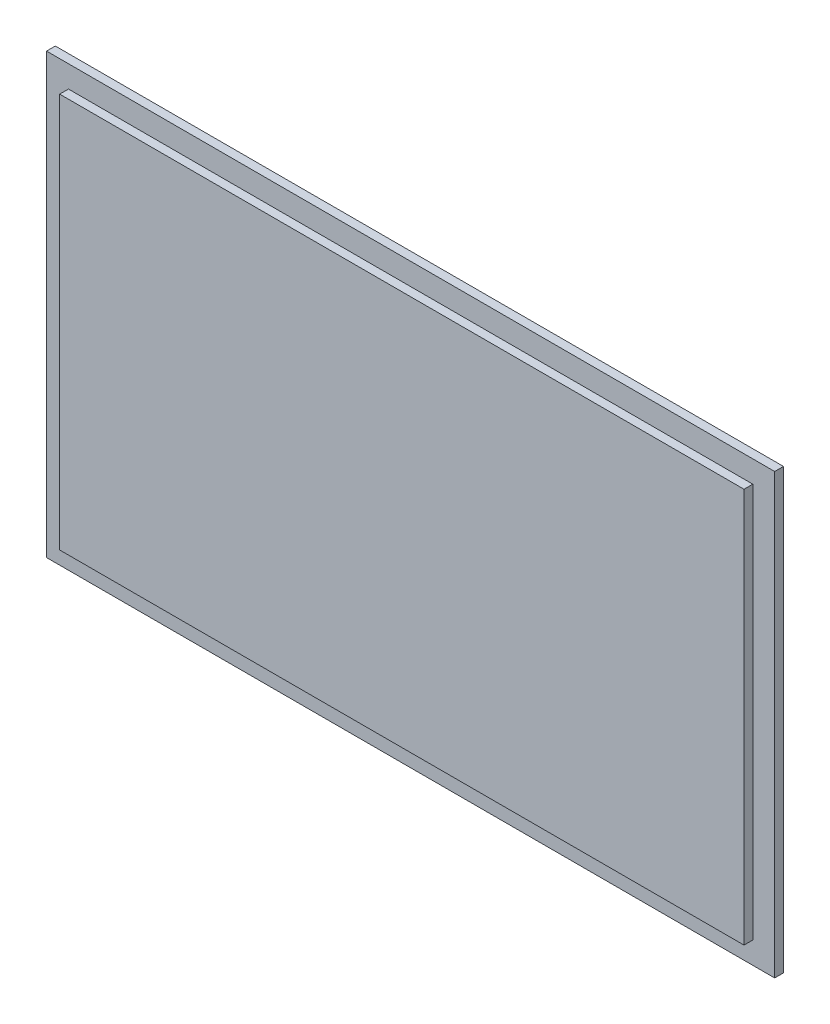
ISO-10303-21;
HEADER;
FILE_DESCRIPTION(('STEP AP214'),'2;1');
FILE_NAME('part.step','',(''),(''),'','','');
FILE_SCHEMA(('AUTOMOTIVE_DESIGN { 1 0 10303 214 1 1 1 1 }'));
ENDSEC;
DATA;
#1=APPLICATION_CONTEXT('core data for automotive mechanical design processes');
#2=APPLICATION_PROTOCOL_DEFINITION('international standard','automotive_design',2000,#1);
#3=PRODUCT_CONTEXT('',#1,'mechanical');
#4=PRODUCT('Part','Part','',(#3));
#5=PRODUCT_RELATED_PRODUCT_CATEGORY('part','',(#4));
#6=PRODUCT_DEFINITION_FORMATION('','',#4);
#7=PRODUCT_DEFINITION_CONTEXT('part definition',#1,'design');
#8=PRODUCT_DEFINITION('design','',#6,#7);
#9=PRODUCT_DEFINITION_SHAPE('','',#8);
#10=(LENGTH_UNIT() NAMED_UNIT(*) SI_UNIT(.MILLI.,.METRE.));
#11=(NAMED_UNIT(*) PLANE_ANGLE_UNIT() SI_UNIT($,.RADIAN.));
#12=(NAMED_UNIT(*) SI_UNIT($,.STERADIAN.) SOLID_ANGLE_UNIT());
#13=UNCERTAINTY_MEASURE_WITH_UNIT(LENGTH_MEASURE(1.E-05),#10,'distance_accuracy_value','');
#14=(GEOMETRIC_REPRESENTATION_CONTEXT(3) GLOBAL_UNCERTAINTY_ASSIGNED_CONTEXT((#13)) GLOBAL_UNIT_ASSIGNED_CONTEXT((#10,
#11,#12)) REPRESENTATION_CONTEXT('',''));
#15=CARTESIAN_POINT('',(0.,0.,0.));
#16=DIRECTION('',(0.,0.,1.));
#17=DIRECTION('',(1.,0.,0.));
#18=AXIS2_PLACEMENT_3D('',#15,#16,#17);
#19=CARTESIAN_POINT('',(0.,0.,-2.));
#20=DIRECTION('',(0.,0.,-1.));
#21=DIRECTION('',(-1.,0.,0.));
#22=AXIS2_PLACEMENT_3D('',#19,#20,#21);
#23=PLANE('',#22);
#24=DIRECTION('',(0.,1.,0.));
#25=VECTOR('',#24,1.);
#26=CARTESIAN_POINT('',(-83.,-50.,-2.));
#27=LINE('',#26,#25);
#28=CARTESIAN_POINT('',(-83.,-50.,-2.));
#29=VERTEX_POINT('',#28);
#30=CARTESIAN_POINT('',(-83.,50.,-2.));
#31=VERTEX_POINT('',#30);
#32=EDGE_CURVE('E154',#29,#31,#27,.T.);
#33=ORIENTED_EDGE('',*,*,#32,.T.);
#34=DIRECTION('',(1.,0.,0.));
#35=VECTOR('',#34,1.);
#36=CARTESIAN_POINT('',(-83.,50.,-2.));
#37=LINE('',#36,#35);
#38=CARTESIAN_POINT('',(83.,50.,-2.));
#39=VERTEX_POINT('',#38);
#40=EDGE_CURVE('E157',#31,#39,#37,.T.);
#41=ORIENTED_EDGE('',*,*,#40,.T.);
#42=DIRECTION('',(0.,-1.,0.));
#43=VECTOR('',#42,1.);
#44=CARTESIAN_POINT('',(83.,50.,-2.));
#45=LINE('',#44,#43);
#46=CARTESIAN_POINT('',(83.,-50.,-2.));
#47=VERTEX_POINT('',#46);
#48=EDGE_CURVE('E160',#39,#47,#45,.T.);
#49=ORIENTED_EDGE('',*,*,#48,.T.);
#50=DIRECTION('',(-1.,0.,0.));
#51=VECTOR('',#50,1.);
#52=CARTESIAN_POINT('',(83.,-50.,-2.));
#53=LINE('',#52,#51);
#54=EDGE_CURVE('E162',#47,#29,#53,.T.);
#55=ORIENTED_EDGE('',*,*,#54,.T.);
#56=EDGE_LOOP('',(#33,#41,#49,#55));
#57=FACE_BOUND('',#56,.T.);
#58=DIRECTION('',(0.,1.,0.));
#59=VECTOR('',#58,1.);
#60=CARTESIAN_POINT('',(-78.,-45.,-2.));
#61=LINE('',#60,#59);
#62=CARTESIAN_POINT('',(-78.,-45.,-2.));
#63=VERTEX_POINT('',#62);
#64=CARTESIAN_POINT('',(-78.,45.,-2.));
#65=VERTEX_POINT('',#64);
#66=EDGE_CURVE('E126',#63,#65,#61,.T.);
#67=ORIENTED_EDGE('',*,*,#66,.F.);
#68=DIRECTION('',(-1.,0.,0.));
#69=VECTOR('',#68,1.);
#70=CARTESIAN_POINT('',(78.,-45.,-2.));
#71=LINE('',#70,#69);
#72=CARTESIAN_POINT('',(78.,-45.,-2.));
#73=VERTEX_POINT('',#72);
#74=EDGE_CURVE('E118',#73,#63,#71,.T.);
#75=ORIENTED_EDGE('',*,*,#74,.F.);
#76=DIRECTION('',(0.,-1.,0.));
#77=VECTOR('',#76,1.);
#78=CARTESIAN_POINT('',(78.,45.,-2.));
#79=LINE('',#78,#77);
#80=CARTESIAN_POINT('',(78.,45.,-2.));
#81=VERTEX_POINT('',#80);
#82=EDGE_CURVE('E140',#81,#73,#79,.T.);
#83=ORIENTED_EDGE('',*,*,#82,.F.);
#84=DIRECTION('',(1.,0.,0.));
#85=VECTOR('',#84,1.);
#86=CARTESIAN_POINT('',(-78.,45.,-2.));
#87=LINE('',#86,#85);
#88=EDGE_CURVE('E138',#65,#81,#87,.T.);
#89=ORIENTED_EDGE('',*,*,#88,.F.);
#90=EDGE_LOOP('',(#67,#75,#83,#89));
#91=FACE_BOUND('',#90,.T.);
#92=ADVANCED_FACE('F53',(#57,#91),#23,.T.);
#93=CARTESIAN_POINT('',(0.,0.,0.));
#94=DIRECTION('',(0.,0.,-1.));
#95=DIRECTION('',(-1.,0.,0.));
#96=AXIS2_PLACEMENT_3D('',#93,#94,#95);
#97=PLANE('',#96);
#98=DIRECTION('',(0.,1.,0.));
#99=VECTOR('',#98,1.);
#100=CARTESIAN_POINT('',(-83.,-50.,0.));
#101=LINE('',#100,#99);
#102=CARTESIAN_POINT('',(-83.,-50.,0.));
#103=VERTEX_POINT('',#102);
#104=CARTESIAN_POINT('',(-83.,50.,0.));
#105=VERTEX_POINT('',#104);
#106=EDGE_CURVE('E134',#103,#105,#101,.T.);
#107=ORIENTED_EDGE('',*,*,#106,.F.);
#108=DIRECTION('',(-1.,0.,0.));
#109=VECTOR('',#108,1.);
#110=CARTESIAN_POINT('',(83.,-50.,0.));
#111=LINE('',#110,#109);
#112=CARTESIAN_POINT('',(83.,-50.,0.));
#113=VERTEX_POINT('',#112);
#114=EDGE_CURVE('E158',#113,#103,#111,.T.);
#115=ORIENTED_EDGE('',*,*,#114,.F.);
#116=DIRECTION('',(0.,-1.,0.));
#117=VECTOR('',#116,1.);
#118=CARTESIAN_POINT('',(83.,50.,0.));
#119=LINE('',#118,#117);
#120=CARTESIAN_POINT('',(83.,50.,0.));
#121=VERTEX_POINT('',#120);
#122=EDGE_CURVE('E169',#121,#113,#119,.T.);
#123=ORIENTED_EDGE('',*,*,#122,.F.);
#124=DIRECTION('',(1.,0.,0.));
#125=VECTOR('',#124,1.);
#126=CARTESIAN_POINT('',(-83.,50.,0.));
#127=LINE('',#126,#125);
#128=EDGE_CURVE('E167',#105,#121,#127,.T.);
#129=ORIENTED_EDGE('',*,*,#128,.F.);
#130=EDGE_LOOP('',(#107,#115,#123,#129));
#131=FACE_BOUND('',#130,.T.);
#132=DIRECTION('',(-1.,0.,0.));
#133=VECTOR('',#132,1.);
#134=CARTESIAN_POINT('',(78.,-45.,0.));
#135=LINE('',#134,#133);
#136=CARTESIAN_POINT('',(78.,-45.,0.));
#137=VERTEX_POINT('',#136);
#138=CARTESIAN_POINT('',(-78.,-45.,0.));
#139=VERTEX_POINT('',#138);
#140=EDGE_CURVE('E76',#137,#139,#135,.T.);
#141=ORIENTED_EDGE('',*,*,#140,.T.);
#142=DIRECTION('',(0.,1.,0.));
#143=VECTOR('',#142,1.);
#144=CARTESIAN_POINT('',(-78.,-45.,0.));
#145=LINE('',#144,#143);
#146=CARTESIAN_POINT('',(-78.,45.,0.));
#147=VERTEX_POINT('',#146);
#148=EDGE_CURVE('E133',#139,#147,#145,.T.);
#149=ORIENTED_EDGE('',*,*,#148,.T.);
#150=DIRECTION('',(1.,0.,0.));
#151=VECTOR('',#150,1.);
#152=CARTESIAN_POINT('',(-78.,45.,0.));
#153=LINE('',#152,#151);
#154=CARTESIAN_POINT('',(78.,45.,0.));
#155=VERTEX_POINT('',#154);
#156=EDGE_CURVE('E146',#147,#155,#153,.T.);
#157=ORIENTED_EDGE('',*,*,#156,.T.);
#158=DIRECTION('',(0.,-1.,0.));
#159=VECTOR('',#158,1.);
#160=CARTESIAN_POINT('',(78.,45.,0.));
#161=LINE('',#160,#159);
#162=EDGE_CURVE('E127',#155,#137,#161,.T.);
#163=ORIENTED_EDGE('',*,*,#162,.T.);
#164=EDGE_LOOP('',(#141,#149,#157,#163));
#165=FACE_BOUND('',#164,.T.);
#166=ADVANCED_FACE('F187',(#131,#165),#97,.F.);
#167=CARTESIAN_POINT('',(-83.,-50.,-2.));
#168=DIRECTION('',(1.,0.,0.));
#169=DIRECTION('',(0.,0.,-1.));
#170=AXIS2_PLACEMENT_3D('',#167,#168,#169);
#171=PLANE('',#170);
#172=ORIENTED_EDGE('',*,*,#106,.T.);
#173=DIRECTION('',(0.,0.,1.));
#174=VECTOR('',#173,1.);
#175=CARTESIAN_POINT('',(-83.,50.,-2.));
#176=LINE('',#175,#174);
#177=EDGE_CURVE('E12',#31,#105,#176,.T.);
#178=ORIENTED_EDGE('',*,*,#177,.F.);
#179=ORIENTED_EDGE('',*,*,#32,.F.);
#180=DIRECTION('',(0.,0.,1.));
#181=VECTOR('',#180,1.);
#182=CARTESIAN_POINT('',(-83.,-50.,-2.));
#183=LINE('',#182,#181);
#184=EDGE_CURVE('E164',#29,#103,#183,.T.);
#185=ORIENTED_EDGE('',*,*,#184,.T.);
#186=EDGE_LOOP('',(#172,#178,#179,#185));
#187=FACE_BOUND('',#186,.T.);
#188=ADVANCED_FACE('F55',(#187),#171,.F.);
#189=CARTESIAN_POINT('',(-83.,50.,-2.));
#190=DIRECTION('',(0.,-1.,0.));
#191=DIRECTION('',(0.,0.,-1.));
#192=AXIS2_PLACEMENT_3D('',#189,#190,#191);
#193=PLANE('',#192);
#194=ORIENTED_EDGE('',*,*,#128,.T.);
#195=DIRECTION('',(0.,0.,1.));
#196=VECTOR('',#195,1.);
#197=CARTESIAN_POINT('',(83.,50.,-2.));
#198=LINE('',#197,#196);
#199=EDGE_CURVE('E61',#39,#121,#198,.T.);
#200=ORIENTED_EDGE('',*,*,#199,.F.);
#201=ORIENTED_EDGE('',*,*,#40,.F.);
#202=ORIENTED_EDGE('',*,*,#177,.T.);
#203=EDGE_LOOP('',(#194,#200,#201,#202));
#204=FACE_BOUND('',#203,.T.);
#205=ADVANCED_FACE('F197',(#204),#193,.F.);
#206=CARTESIAN_POINT('',(83.,50.,-2.));
#207=DIRECTION('',(-1.,0.,0.));
#208=DIRECTION('',(0.,0.,1.));
#209=AXIS2_PLACEMENT_3D('',#206,#207,#208);
#210=PLANE('',#209);
#211=ORIENTED_EDGE('',*,*,#122,.T.);
#212=DIRECTION('',(0.,0.,1.));
#213=VECTOR('',#212,1.);
#214=CARTESIAN_POINT('',(83.,-50.,-2.));
#215=LINE('',#214,#213);
#216=EDGE_CURVE('E174',#47,#113,#215,.T.);
#217=ORIENTED_EDGE('',*,*,#216,.F.);
#218=ORIENTED_EDGE('',*,*,#48,.F.);
#219=ORIENTED_EDGE('',*,*,#199,.T.);
#220=EDGE_LOOP('',(#211,#217,#218,#219));
#221=FACE_BOUND('',#220,.T.);
#222=ADVANCED_FACE('F181',(#221),#210,.F.);
#223=CARTESIAN_POINT('',(83.,-50.,-2.));
#224=DIRECTION('',(0.,1.,0.));
#225=DIRECTION('',(0.,0.,1.));
#226=AXIS2_PLACEMENT_3D('',#223,#224,#225);
#227=PLANE('',#226);
#228=ORIENTED_EDGE('',*,*,#114,.T.);
#229=ORIENTED_EDGE('',*,*,#184,.F.);
#230=ORIENTED_EDGE('',*,*,#54,.F.);
#231=ORIENTED_EDGE('',*,*,#216,.T.);
#232=EDGE_LOOP('',(#228,#229,#230,#231));
#233=FACE_BOUND('',#232,.T.);
#234=ADVANCED_FACE('F191',(#233),#227,.F.);
#235=CARTESIAN_POINT('',(78.,-45.,-2.));
#236=DIRECTION('',(0.,1.,0.));
#237=DIRECTION('',(-1.,0.,0.));
#238=AXIS2_PLACEMENT_3D('',#235,#236,#237);
#239=PLANE('',#238);
#240=ORIENTED_EDGE('',*,*,#140,.F.);
#241=DIRECTION('',(0.,0.,1.));
#242=VECTOR('',#241,1.);
#243=CARTESIAN_POINT('',(78.,-45.,-2.));
#244=LINE('',#243,#242);
#245=EDGE_CURVE('E122',#73,#137,#244,.T.);
#246=ORIENTED_EDGE('',*,*,#245,.F.);
#247=ORIENTED_EDGE('',*,*,#74,.T.);
#248=DIRECTION('',(0.,0.,1.));
#249=VECTOR('',#248,1.);
#250=CARTESIAN_POINT('',(-78.,-45.,-2.));
#251=LINE('',#250,#249);
#252=EDGE_CURVE('E121',#63,#139,#251,.T.);
#253=ORIENTED_EDGE('',*,*,#252,.T.);
#254=EDGE_LOOP('',(#240,#246,#247,#253));
#255=FACE_BOUND('',#254,.T.);
#256=ADVANCED_FACE('F120',(#255),#239,.T.);
#257=CARTESIAN_POINT('',(-78.,-45.,-2.));
#258=DIRECTION('',(1.,0.,0.));
#259=DIRECTION('',(0.,0.,-1.));
#260=AXIS2_PLACEMENT_3D('',#257,#258,#259);
#261=PLANE('',#260);
#262=ORIENTED_EDGE('',*,*,#148,.F.);
#263=ORIENTED_EDGE('',*,*,#252,.F.);
#264=ORIENTED_EDGE('',*,*,#66,.T.);
#265=DIRECTION('',(0.,0.,1.));
#266=VECTOR('',#265,1.);
#267=CARTESIAN_POINT('',(-78.,45.,-2.));
#268=LINE('',#267,#266);
#269=EDGE_CURVE('E135',#65,#147,#268,.T.);
#270=ORIENTED_EDGE('',*,*,#269,.T.);
#271=EDGE_LOOP('',(#262,#263,#264,#270));
#272=FACE_BOUND('',#271,.T.);
#273=ADVANCED_FACE('F130',(#272),#261,.T.);
#274=CARTESIAN_POINT('',(-78.,45.,-2.));
#275=DIRECTION('',(0.,-1.,0.));
#276=DIRECTION('',(1.,0.,0.));
#277=AXIS2_PLACEMENT_3D('',#274,#275,#276);
#278=PLANE('',#277);
#279=ORIENTED_EDGE('',*,*,#156,.F.);
#280=ORIENTED_EDGE('',*,*,#269,.F.);
#281=ORIENTED_EDGE('',*,*,#88,.T.);
#282=DIRECTION('',(0.,0.,1.));
#283=VECTOR('',#282,1.);
#284=CARTESIAN_POINT('',(78.,45.,-2.));
#285=LINE('',#284,#283);
#286=EDGE_CURVE('E68',#81,#155,#285,.T.);
#287=ORIENTED_EDGE('',*,*,#286,.T.);
#288=EDGE_LOOP('',(#279,#280,#281,#287));
#289=FACE_BOUND('',#288,.T.);
#290=ADVANCED_FACE('F220',(#289),#278,.T.);
#291=CARTESIAN_POINT('',(78.,45.,-2.));
#292=DIRECTION('',(-1.,0.,0.));
#293=DIRECTION('',(0.,0.,1.));
#294=AXIS2_PLACEMENT_3D('',#291,#292,#293);
#295=PLANE('',#294);
#296=ORIENTED_EDGE('',*,*,#162,.F.);
#297=ORIENTED_EDGE('',*,*,#286,.F.);
#298=ORIENTED_EDGE('',*,*,#82,.T.);
#299=ORIENTED_EDGE('',*,*,#245,.T.);
#300=EDGE_LOOP('',(#296,#297,#298,#299));
#301=FACE_BOUND('',#300,.T.);
#302=ADVANCED_FACE('F224',(#301),#295,.T.);
#303=CLOSED_SHELL('',(#92,#166,#188,#205,#222,#234,#256,#273,#290,#302));
#304=MANIFOLD_SOLID_BREP('B2',#303);
#305=CARTESIAN_POINT('',(-78.,-45.,2.));
#306=DIRECTION('',(1.,0.,0.));
#307=DIRECTION('',(0.,0.,-1.));
#308=AXIS2_PLACEMENT_3D('',#305,#306,#307);
#309=PLANE('',#308);
#310=DIRECTION('',(0.,-1.,0.));
#311=VECTOR('',#310,1.);
#312=CARTESIAN_POINT('',(-78.,-45.,0.));
#313=LINE('',#312,#311);
#314=CARTESIAN_POINT('',(-78.,45.,0.));
#315=VERTEX_POINT('',#314);
#316=CARTESIAN_POINT('',(-78.,-45.,0.));
#317=VERTEX_POINT('',#316);
#318=EDGE_CURVE('E371',#315,#317,#313,.T.);
#319=ORIENTED_EDGE('',*,*,#318,.T.);
#320=DIRECTION('',(0.,0.,-1.));
#321=VECTOR('',#320,1.);
#322=CARTESIAN_POINT('',(-78.,-45.,2.));
#323=LINE('',#322,#321);
#324=CARTESIAN_POINT('',(-78.,-45.,2.));
#325=VERTEX_POINT('',#324);
#326=EDGE_CURVE('E51',#325,#317,#323,.T.);
#327=ORIENTED_EDGE('',*,*,#326,.F.);
#328=DIRECTION('',(0.,-1.,0.));
#329=VECTOR('',#328,1.);
#330=CARTESIAN_POINT('',(-78.,-45.,2.));
#331=LINE('',#330,#329);
#332=CARTESIAN_POINT('',(-78.,45.,2.));
#333=VERTEX_POINT('',#332);
#334=EDGE_CURVE('E355',#333,#325,#331,.T.);
#335=ORIENTED_EDGE('',*,*,#334,.F.);
#336=DIRECTION('',(0.,0.,-1.));
#337=VECTOR('',#336,1.);
#338=CARTESIAN_POINT('',(-78.,45.,2.));
#339=LINE('',#338,#337);
#340=EDGE_CURVE('E367',#333,#315,#339,.T.);
#341=ORIENTED_EDGE('',*,*,#340,.T.);
#342=EDGE_LOOP('',(#319,#327,#335,#341));
#343=FACE_BOUND('',#342,.T.);
#344=ADVANCED_FACE('F303',(#343),#309,.F.);
#345=CARTESIAN_POINT('',(78.,-45.,2.));
#346=DIRECTION('',(0.,1.,0.));
#347=DIRECTION('',(-1.,0.,0.));
#348=AXIS2_PLACEMENT_3D('',#345,#346,#347);
#349=PLANE('',#348);
#350=DIRECTION('',(1.,0.,0.));
#351=VECTOR('',#350,1.);
#352=CARTESIAN_POINT('',(78.,-45.,0.));
#353=LINE('',#352,#351);
#354=CARTESIAN_POINT('',(78.,-45.,0.));
#355=VERTEX_POINT('',#354);
#356=EDGE_CURVE('E360',#317,#355,#353,.T.);
#357=ORIENTED_EDGE('',*,*,#356,.T.);
#358=DIRECTION('',(0.,0.,-1.));
#359=VECTOR('',#358,1.);
#360=CARTESIAN_POINT('',(78.,-45.,2.));
#361=LINE('',#360,#359);
#362=CARTESIAN_POINT('',(78.,-45.,2.));
#363=VERTEX_POINT('',#362);
#364=EDGE_CURVE('E312',#363,#355,#361,.T.);
#365=ORIENTED_EDGE('',*,*,#364,.F.);
#366=DIRECTION('',(1.,0.,0.));
#367=VECTOR('',#366,1.);
#368=CARTESIAN_POINT('',(78.,-45.,2.));
#369=LINE('',#368,#367);
#370=EDGE_CURVE('E350',#325,#363,#369,.T.);
#371=ORIENTED_EDGE('',*,*,#370,.F.);
#372=ORIENTED_EDGE('',*,*,#326,.T.);
#373=EDGE_LOOP('',(#357,#365,#371,#372));
#374=FACE_BOUND('',#373,.T.);
#375=ADVANCED_FACE('F359',(#374),#349,.F.);
#376=CARTESIAN_POINT('',(78.,-45.,2.));
#377=DIRECTION('',(-1.,0.,0.));
#378=DIRECTION('',(0.,0.,1.));
#379=AXIS2_PLACEMENT_3D('',#376,#377,#378);
#380=PLANE('',#379);
#381=DIRECTION('',(0.,1.,0.));
#382=VECTOR('',#381,1.);
#383=CARTESIAN_POINT('',(78.,-45.,0.));
#384=LINE('',#383,#382);
#385=CARTESIAN_POINT('',(78.,45.,0.));
#386=VERTEX_POINT('',#385);
#387=EDGE_CURVE('E337',#355,#386,#384,.T.);
#388=ORIENTED_EDGE('',*,*,#387,.T.);
#389=DIRECTION('',(0.,0.,-1.));
#390=VECTOR('',#389,1.);
#391=CARTESIAN_POINT('',(78.,45.,2.));
#392=LINE('',#391,#390);
#393=CARTESIAN_POINT('',(78.,45.,2.));
#394=VERTEX_POINT('',#393);
#395=EDGE_CURVE('E362',#394,#386,#392,.T.);
#396=ORIENTED_EDGE('',*,*,#395,.F.);
#397=DIRECTION('',(0.,1.,0.));
#398=VECTOR('',#397,1.);
#399=CARTESIAN_POINT('',(78.,-45.,2.));
#400=LINE('',#399,#398);
#401=EDGE_CURVE('E353',#363,#394,#400,.T.);
#402=ORIENTED_EDGE('',*,*,#401,.F.);
#403=ORIENTED_EDGE('',*,*,#364,.T.);
#404=EDGE_LOOP('',(#388,#396,#402,#403));
#405=FACE_BOUND('',#404,.T.);
#406=ADVANCED_FACE('F363',(#405),#380,.F.);
#407=CARTESIAN_POINT('',(78.,45.,2.));
#408=DIRECTION('',(0.,-1.,0.));
#409=DIRECTION('',(1.,0.,0.));
#410=AXIS2_PLACEMENT_3D('',#407,#408,#409);
#411=PLANE('',#410);
#412=DIRECTION('',(-1.,0.,0.));
#413=VECTOR('',#412,1.);
#414=CARTESIAN_POINT('',(78.,45.,0.));
#415=LINE('',#414,#413);
#416=EDGE_CURVE('E343',#386,#315,#415,.T.);
#417=ORIENTED_EDGE('',*,*,#416,.T.);
#418=ORIENTED_EDGE('',*,*,#340,.F.);
#419=DIRECTION('',(-1.,0.,0.));
#420=VECTOR('',#419,1.);
#421=CARTESIAN_POINT('',(78.,45.,2.));
#422=LINE('',#421,#420);
#423=EDGE_CURVE('E320',#394,#333,#422,.T.);
#424=ORIENTED_EDGE('',*,*,#423,.F.);
#425=ORIENTED_EDGE('',*,*,#395,.T.);
#426=EDGE_LOOP('',(#417,#418,#424,#425));
#427=FACE_BOUND('',#426,.T.);
#428=ADVANCED_FACE('F384',(#427),#411,.F.);
#429=CARTESIAN_POINT('',(0.,0.,2.));
#430=DIRECTION('',(0.,0.,1.));
#431=DIRECTION('',(1.,0.,0.));
#432=AXIS2_PLACEMENT_3D('',#429,#430,#431);
#433=PLANE('',#432);
#434=ORIENTED_EDGE('',*,*,#334,.T.);
#435=ORIENTED_EDGE('',*,*,#370,.T.);
#436=ORIENTED_EDGE('',*,*,#401,.T.);
#437=ORIENTED_EDGE('',*,*,#423,.T.);
#438=EDGE_LOOP('',(#434,#435,#436,#437));
#439=FACE_BOUND('',#438,.T.);
#440=ADVANCED_FACE('F351',(#439),#433,.T.);
#441=CARTESIAN_POINT('',(0.,0.,0.));
#442=DIRECTION('',(0.,0.,1.));
#443=DIRECTION('',(1.,0.,0.));
#444=AXIS2_PLACEMENT_3D('',#441,#442,#443);
#445=PLANE('',#444);
#446=ORIENTED_EDGE('',*,*,#318,.F.);
#447=ORIENTED_EDGE('',*,*,#416,.F.);
#448=ORIENTED_EDGE('',*,*,#387,.F.);
#449=ORIENTED_EDGE('',*,*,#356,.F.);
#450=EDGE_LOOP('',(#446,#447,#448,#449));
#451=FACE_BOUND('',#450,.T.);
#452=ADVANCED_FACE('F387',(#451),#445,.F.);
#453=CLOSED_SHELL('',(#344,#375,#406,#428,#440,#452));
#454=MANIFOLD_SOLID_BREP('B6',#453);
#455=ADVANCED_BREP_SHAPE_REPRESENTATION('',(#18,#304,#454),#14);
#456=SHAPE_DEFINITION_REPRESENTATION(#9,#455);
ENDSEC;
END-ISO-10303-21;
